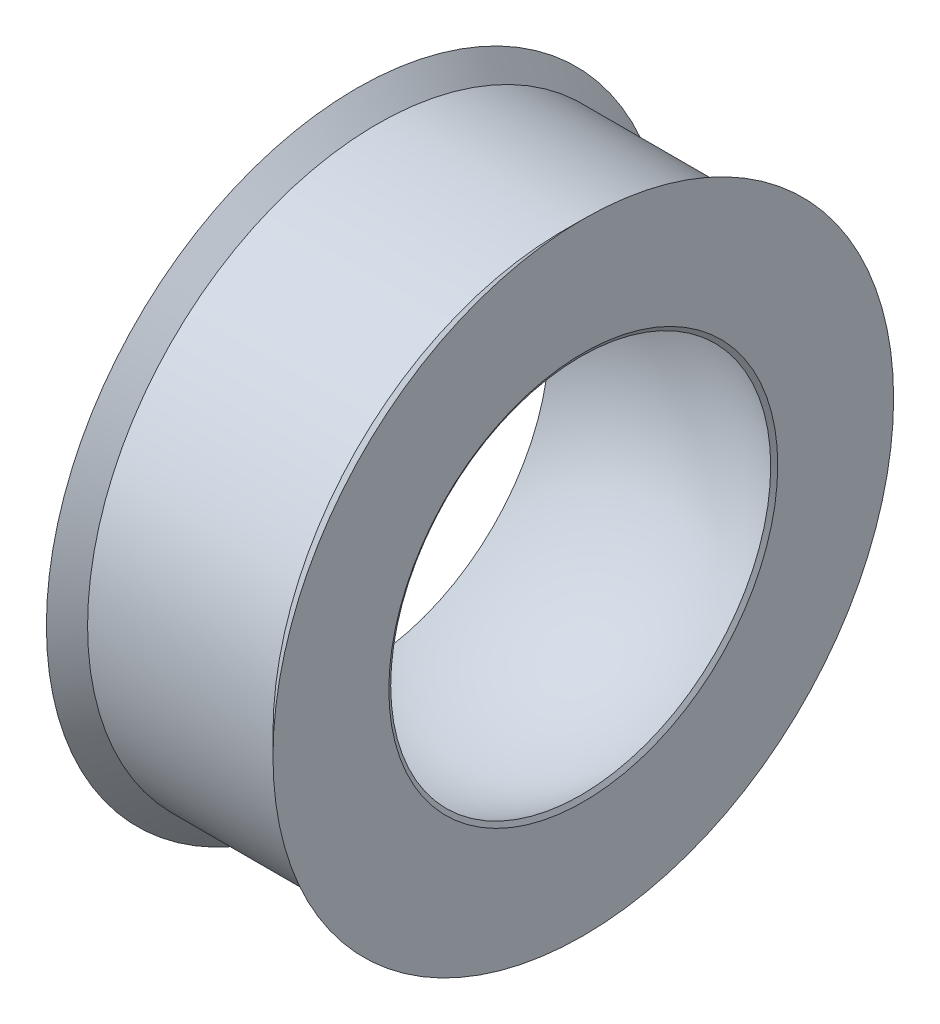
ISO-10303-21;
HEADER;
FILE_DESCRIPTION(('STEP AP214'),'2;1');
FILE_NAME('part.step','',(''),(''),'','','');
FILE_SCHEMA(('AUTOMOTIVE_DESIGN { 1 0 10303 214 1 1 1 1 }'));
ENDSEC;
DATA;
#1=APPLICATION_CONTEXT('core data for automotive mechanical design processes');
#2=APPLICATION_PROTOCOL_DEFINITION('international standard','automotive_design',2000,#1);
#3=PRODUCT_CONTEXT('',#1,'mechanical');
#4=PRODUCT('Part','Part','',(#3));
#5=PRODUCT_RELATED_PRODUCT_CATEGORY('part','',(#4));
#6=PRODUCT_DEFINITION_FORMATION('','',#4);
#7=PRODUCT_DEFINITION_CONTEXT('part definition',#1,'design');
#8=PRODUCT_DEFINITION('design','',#6,#7);
#9=PRODUCT_DEFINITION_SHAPE('','',#8);
#10=(LENGTH_UNIT() NAMED_UNIT(*) SI_UNIT(.MILLI.,.METRE.));
#11=(NAMED_UNIT(*) PLANE_ANGLE_UNIT() SI_UNIT($,.RADIAN.));
#12=(NAMED_UNIT(*) SI_UNIT($,.STERADIAN.) SOLID_ANGLE_UNIT());
#13=UNCERTAINTY_MEASURE_WITH_UNIT(LENGTH_MEASURE(1.E-05),#10,'distance_accuracy_value','');
#14=(GEOMETRIC_REPRESENTATION_CONTEXT(3) GLOBAL_UNCERTAINTY_ASSIGNED_CONTEXT((#13)) GLOBAL_UNIT_ASSIGNED_CONTEXT((#10,
#11,#12)) REPRESENTATION_CONTEXT('',''));
#15=CARTESIAN_POINT('',(0.,0.,0.));
#16=DIRECTION('',(0.,0.,1.));
#17=DIRECTION('',(1.,0.,0.));
#18=AXIS2_PLACEMENT_3D('',#15,#16,#17);
#19=CARTESIAN_POINT('',(-2.794,0.,0.));
#20=DIRECTION('',(-1.,0.,0.));
#21=DIRECTION('',(0.,0.,1.));
#22=AXIS2_PLACEMENT_3D('',#19,#20,#21);
#23=CONICAL_SURFACE('',#22,4.79530541363112,1.04322949246578);
#24=CARTESIAN_POINT('',(-2.73006407322655,0.,0.));
#25=DIRECTION('',(1.,0.,0.));
#26=DIRECTION('',(0.,0.,-1.));
#27=AXIS2_PLACEMENT_3D('',#24,#25,#26);
#28=CIRCLE('',#27,4.68557302430318);
#29=CARTESIAN_POINT('',(-2.73006407322655,0.,-4.68557302430318));
#30=VERTEX_POINT('',#29);
#31=EDGE_CURVE('E56',#30,#30,#28,.F.);
#32=ORIENTED_EDGE('',*,*,#31,.F.);
#33=EDGE_LOOP('',(#32));
#34=FACE_BOUND('',#33,.T.);
#35=CARTESIAN_POINT('',(-2.794,0.,0.));
#36=DIRECTION('',(1.,0.,0.));
#37=DIRECTION('',(0.,0.,-1.));
#38=AXIS2_PLACEMENT_3D('',#35,#36,#37);
#39=CIRCLE('',#38,4.79530541363112);
#40=CARTESIAN_POINT('',(-2.794,0.,-4.79530541363112));
#41=VERTEX_POINT('',#40);
#42=EDGE_CURVE('E62',#41,#41,#39,.F.);
#43=ORIENTED_EDGE('',*,*,#42,.T.);
#44=EDGE_LOOP('',(#43));
#45=FACE_BOUND('',#44,.T.);
#46=ADVANCED_FACE('F48',(#34,#45),#23,.F.);
#47=CARTESIAN_POINT('',(2.794,0.,0.));
#48=DIRECTION('',(1.,0.,0.));
#49=DIRECTION('',(0.,0.,-1.));
#50=AXIS2_PLACEMENT_3D('',#47,#48,#49);
#51=CONICAL_SURFACE('',#50,4.79530541363112,1.04322949246578);
#52=CARTESIAN_POINT('',(2.73006407322655,0.,0.));
#53=DIRECTION('',(-1.,0.,0.));
#54=DIRECTION('',(0.,0.,1.));
#55=AXIS2_PLACEMENT_3D('',#52,#53,#54);
#56=CIRCLE('',#55,4.68557302430318);
#57=CARTESIAN_POINT('',(2.73006407322655,0.,4.68557302430318));
#58=VERTEX_POINT('',#57);
#59=EDGE_CURVE('E11',#58,#58,#56,.F.);
#60=ORIENTED_EDGE('',*,*,#59,.F.);
#61=EDGE_LOOP('',(#60));
#62=FACE_BOUND('',#61,.T.);
#63=CARTESIAN_POINT('',(2.794,0.,0.));
#64=DIRECTION('',(-1.,0.,0.));
#65=DIRECTION('',(0.,0.,1.));
#66=AXIS2_PLACEMENT_3D('',#63,#64,#65);
#67=CIRCLE('',#66,4.79530541363112);
#68=CARTESIAN_POINT('',(2.794,0.,4.79530541363112));
#69=VERTEX_POINT('',#68);
#70=EDGE_CURVE('E52',#69,#69,#67,.F.);
#71=ORIENTED_EDGE('',*,*,#70,.T.);
#72=EDGE_LOOP('',(#71));
#73=FACE_BOUND('',#72,.T.);
#74=ADVANCED_FACE('F50',(#62,#73),#51,.F.);
#75=CARTESIAN_POINT('',(0.,0.,0.));
#76=DIRECTION('',(0.,0.,1.));
#77=DIRECTION('',(0.,1.,0.));
#78=AXIS2_PLACEMENT_3D('',#75,#76,#77);
#79=SPHERICAL_SURFACE('',#78,5.4229);
#80=CARTESIAN_POINT('',(0.,0.,0.));
#81=DIRECTION('',(1.,0.,0.));
#82=DIRECTION('',(0.,0.,-1.));
#83=AXIS2_PLACEMENT_3D('',#80,#81,#82);
#84=SPHERICAL_SURFACE('',#83,5.4229);
#85=ORIENTED_EDGE('',*,*,#31,.T.);
#86=EDGE_LOOP('',(#85));
#87=FACE_BOUND('',#86,.T.);
#88=ORIENTED_EDGE('',*,*,#59,.T.);
#89=EDGE_LOOP('',(#88));
#90=FACE_BOUND('',#89,.T.);
#91=ADVANCED_FACE('F72',(#87,#90),#84,.F.);
#92=CARTESIAN_POINT('',(0.,0.,0.));
#93=DIRECTION('',(0.,0.,1.));
#94=DIRECTION('',(0.,1.,0.));
#95=AXIS2_PLACEMENT_3D('',#92,#93,#94);
#96=SPHERICAL_SURFACE('',#95,5.5499);
#97=CARTESIAN_POINT('',(0.,0.,0.));
#98=DIRECTION('',(1.,0.,0.));
#99=DIRECTION('',(0.,0.,-1.));
#100=AXIS2_PLACEMENT_3D('',#97,#98,#99);
#101=SPHERICAL_SURFACE('',#100,5.5499);
#102=ORIENTED_EDGE('',*,*,#42,.F.);
#103=EDGE_LOOP('',(#102));
#104=FACE_BOUND('',#103,.T.);
#105=ORIENTED_EDGE('',*,*,#70,.F.);
#106=EDGE_LOOP('',(#105));
#107=FACE_BOUND('',#106,.T.);
#108=ADVANCED_FACE('F70',(#104,#107),#101,.T.);
#109=CLOSED_SHELL('',(#46,#74,#91,#108));
#110=MANIFOLD_SOLID_BREP('B2',#109);
#111=CARTESIAN_POINT('',(-2.286,0.,0.));
#112=DIRECTION('',(-1.,0.,0.));
#113=DIRECTION('',(0.,0.,1.));
#114=AXIS2_PLACEMENT_3D('',#111,#112,#113);
#115=CONICAL_SURFACE('',#114,7.14502,0.785398163397443);
#116=CARTESIAN_POINT('',(-2.794,0.,0.));
#117=DIRECTION('',(-1.,0.,0.));
#118=DIRECTION('',(0.,0.,1.));
#119=AXIS2_PLACEMENT_3D('',#116,#117,#118);
#120=CIRCLE('',#119,7.65302);
#121=CARTESIAN_POINT('',(-2.794,0.,7.65302));
#122=VERTEX_POINT('',#121);
#123=EDGE_CURVE('E125',#122,#122,#120,.T.);
#124=ORIENTED_EDGE('',*,*,#123,.F.);
#125=EDGE_LOOP('',(#124));
#126=FACE_BOUND('',#125,.T.);
#127=CARTESIAN_POINT('',(-2.286,0.,0.));
#128=DIRECTION('',(-1.,0.,0.));
#129=DIRECTION('',(0.,0.,1.));
#130=AXIS2_PLACEMENT_3D('',#127,#128,#129);
#131=CIRCLE('',#130,7.14502);
#132=CARTESIAN_POINT('',(-2.286,0.,7.14502));
#133=VERTEX_POINT('',#132);
#134=EDGE_CURVE('E47',#133,#133,#131,.T.);
#135=ORIENTED_EDGE('',*,*,#134,.T.);
#136=EDGE_LOOP('',(#135));
#137=FACE_BOUND('',#136,.T.);
#138=ADVANCED_FACE('F109',(#126,#137),#115,.T.);
#139=CARTESIAN_POINT('',(-5.87322229423055,0.,0.));
#140=DIRECTION('',(-1.,0.,0.));
#141=DIRECTION('',(0.,0.,1.));
#142=AXIS2_PLACEMENT_3D('',#139,#140,#141);
#143=CYLINDRICAL_SURFACE('',#142,7.14502);
#144=ORIENTED_EDGE('',*,*,#134,.F.);
#145=EDGE_LOOP('',(#144));
#146=FACE_BOUND('',#145,.T.);
#147=CARTESIAN_POINT('',(2.286,0.,0.));
#148=DIRECTION('',(-1.,0.,0.));
#149=DIRECTION('',(0.,0.,1.));
#150=AXIS2_PLACEMENT_3D('',#147,#148,#149);
#151=CIRCLE('',#150,7.14502);
#152=CARTESIAN_POINT('',(2.286,0.,7.14502));
#153=VERTEX_POINT('',#152);
#154=EDGE_CURVE('E116',#153,#153,#151,.T.);
#155=ORIENTED_EDGE('',*,*,#154,.T.);
#156=EDGE_LOOP('',(#155));
#157=FACE_BOUND('',#156,.T.);
#158=ADVANCED_FACE('F145',(#146,#157),#143,.T.);
#159=CARTESIAN_POINT('',(2.79400000000001,0.,0.));
#160=DIRECTION('',(1.,0.,0.));
#161=DIRECTION('',(0.,0.,-1.));
#162=AXIS2_PLACEMENT_3D('',#159,#160,#161);
#163=CONICAL_SURFACE('',#162,7.65302,0.785398163397444);
#164=ORIENTED_EDGE('',*,*,#154,.F.);
#165=EDGE_LOOP('',(#164));
#166=FACE_BOUND('',#165,.T.);
#167=CARTESIAN_POINT('',(2.79400000000001,0.,0.));
#168=DIRECTION('',(-1.,0.,0.));
#169=DIRECTION('',(0.,0.,1.));
#170=AXIS2_PLACEMENT_3D('',#167,#168,#169);
#171=CIRCLE('',#170,7.65302);
#172=CARTESIAN_POINT('',(2.79400000000001,0.,7.65302));
#173=VERTEX_POINT('',#172);
#174=EDGE_CURVE('E120',#173,#173,#171,.T.);
#175=ORIENTED_EDGE('',*,*,#174,.T.);
#176=EDGE_LOOP('',(#175));
#177=FACE_BOUND('',#176,.T.);
#178=ADVANCED_FACE('F149',(#166,#177),#163,.T.);
#179=CARTESIAN_POINT('',(2.794,7.65302,0.));
#180=DIRECTION('',(-1.,0.,0.));
#181=DIRECTION('',(0.,0.,1.));
#182=AXIS2_PLACEMENT_3D('',#179,#180,#181);
#183=PLANE('',#182);
#184=CARTESIAN_POINT('',(2.794,0.,0.));
#185=DIRECTION('',(-1.,0.,0.));
#186=DIRECTION('',(0.,0.,1.));
#187=AXIS2_PLACEMENT_3D('',#184,#185,#186);
#188=CIRCLE('',#187,4.79530541363112);
#189=CARTESIAN_POINT('',(2.794,0.,4.79530541363112));
#190=VERTEX_POINT('',#189);
#191=EDGE_CURVE('E128',#190,#190,#188,.F.);
#192=ORIENTED_EDGE('',*,*,#191,.F.);
#193=EDGE_LOOP('',(#192));
#194=FACE_BOUND('',#193,.T.);
#195=ORIENTED_EDGE('',*,*,#174,.F.);
#196=EDGE_LOOP('',(#195));
#197=FACE_BOUND('',#196,.T.);
#198=ADVANCED_FACE('F140',(#194,#197),#183,.F.);
#199=CARTESIAN_POINT('',(-2.794,7.65302,0.));
#200=DIRECTION('',(1.,0.,0.));
#201=DIRECTION('',(0.,0.,-1.));
#202=AXIS2_PLACEMENT_3D('',#199,#200,#201);
#203=PLANE('',#202);
#204=CARTESIAN_POINT('',(-2.794,0.,0.));
#205=DIRECTION('',(1.,0.,0.));
#206=DIRECTION('',(0.,0.,-1.));
#207=AXIS2_PLACEMENT_3D('',#204,#205,#206);
#208=CIRCLE('',#207,4.79530541363112);
#209=CARTESIAN_POINT('',(-2.794,0.,-4.79530541363112));
#210=VERTEX_POINT('',#209);
#211=EDGE_CURVE('E112',#210,#210,#208,.F.);
#212=ORIENTED_EDGE('',*,*,#211,.F.);
#213=EDGE_LOOP('',(#212));
#214=FACE_BOUND('',#213,.T.);
#215=ORIENTED_EDGE('',*,*,#123,.T.);
#216=EDGE_LOOP('',(#215));
#217=FACE_BOUND('',#216,.T.);
#218=ADVANCED_FACE('F137',(#214,#217),#203,.F.);
#219=CARTESIAN_POINT('',(0.,0.,0.));
#220=DIRECTION('',(0.,0.,1.));
#221=DIRECTION('',(0.,1.,0.));
#222=AXIS2_PLACEMENT_3D('',#219,#220,#221);
#223=SPHERICAL_SURFACE('',#222,5.5499);
#224=CARTESIAN_POINT('',(0.,0.,0.));
#225=DIRECTION('',(1.,0.,0.));
#226=DIRECTION('',(0.,0.,-1.));
#227=AXIS2_PLACEMENT_3D('',#224,#225,#226);
#228=SPHERICAL_SURFACE('',#227,5.5499);
#229=ORIENTED_EDGE('',*,*,#211,.T.);
#230=EDGE_LOOP('',(#229));
#231=FACE_BOUND('',#230,.T.);
#232=ORIENTED_EDGE('',*,*,#191,.T.);
#233=EDGE_LOOP('',(#232));
#234=FACE_BOUND('',#233,.T.);
#235=ADVANCED_FACE('F135',(#231,#234),#228,.F.);
#236=CLOSED_SHELL('',(#138,#158,#178,#198,#218,#235));
#237=MANIFOLD_SOLID_BREP('B6',#236);
#238=ADVANCED_BREP_SHAPE_REPRESENTATION('',(#18,#110,#237),#14);
#239=SHAPE_DEFINITION_REPRESENTATION(#9,#238);
ENDSEC;
END-ISO-10303-21;
